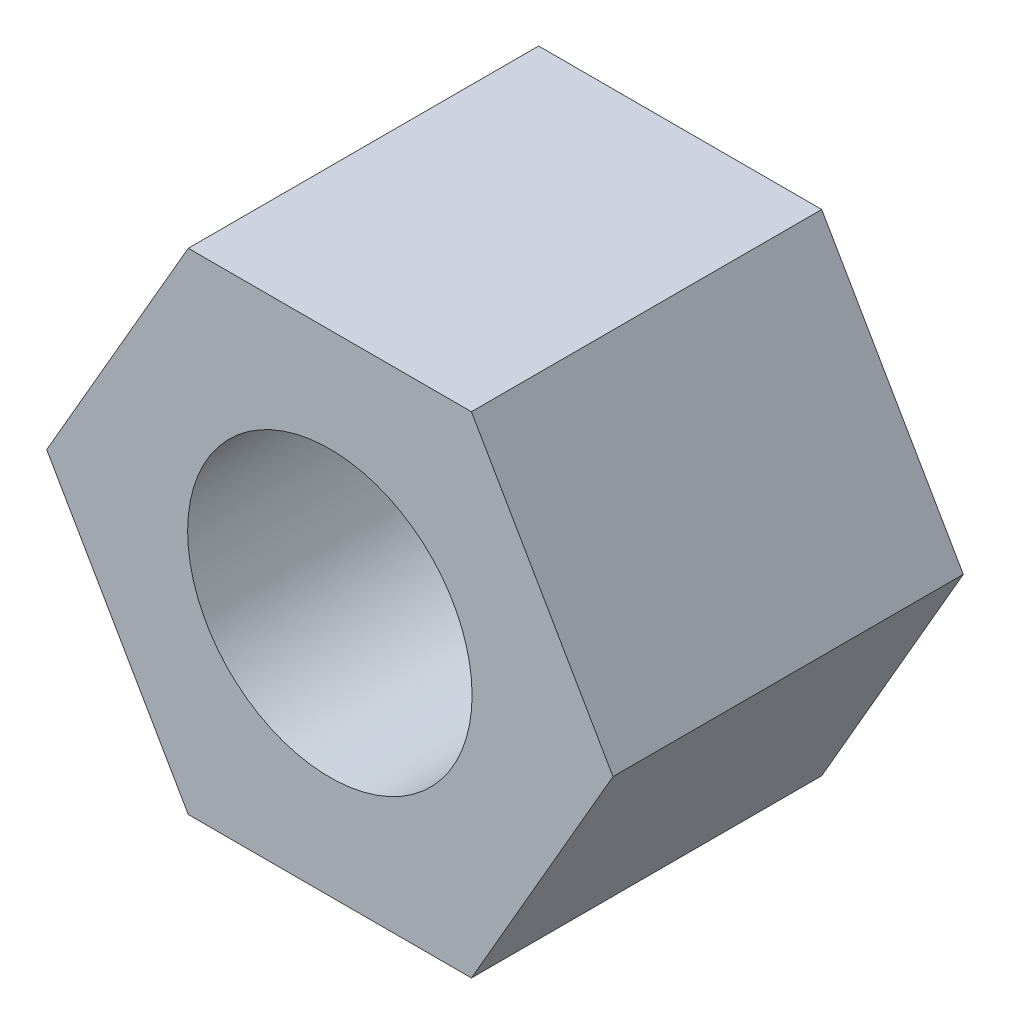
ISO-10303-21;
HEADER;
FILE_DESCRIPTION(('STEP AP214'),'2;1');
FILE_NAME('part.step','',(''),(''),'','','');
FILE_SCHEMA(('AUTOMOTIVE_DESIGN { 1 0 10303 214 1 1 1 1 }'));
ENDSEC;
DATA;
#1=APPLICATION_CONTEXT('core data for automotive mechanical design processes');
#2=APPLICATION_PROTOCOL_DEFINITION('international standard','automotive_design',2000,#1);
#3=PRODUCT_CONTEXT('',#1,'mechanical');
#4=PRODUCT('Part','Part','',(#3));
#5=PRODUCT_RELATED_PRODUCT_CATEGORY('part','',(#4));
#6=PRODUCT_DEFINITION_FORMATION('','',#4);
#7=PRODUCT_DEFINITION_CONTEXT('part definition',#1,'design');
#8=PRODUCT_DEFINITION('design','',#6,#7);
#9=PRODUCT_DEFINITION_SHAPE('','',#8);
#10=(LENGTH_UNIT() NAMED_UNIT(*) SI_UNIT(.MILLI.,.METRE.));
#11=(NAMED_UNIT(*) PLANE_ANGLE_UNIT() SI_UNIT($,.RADIAN.));
#12=(NAMED_UNIT(*) SI_UNIT($,.STERADIAN.) SOLID_ANGLE_UNIT());
#13=UNCERTAINTY_MEASURE_WITH_UNIT(LENGTH_MEASURE(1.E-05),#10,'distance_accuracy_value','');
#14=(GEOMETRIC_REPRESENTATION_CONTEXT(3) GLOBAL_UNCERTAINTY_ASSIGNED_CONTEXT((#13)) GLOBAL_UNIT_ASSIGNED_CONTEXT((#10,
#11,#12)) REPRESENTATION_CONTEXT('',''));
#15=CARTESIAN_POINT('',(0.,0.,0.));
#16=DIRECTION('',(0.,0.,1.));
#17=DIRECTION('',(1.,0.,0.));
#18=AXIS2_PLACEMENT_3D('',#15,#16,#17);
#19=CARTESIAN_POINT('',(0.,0.,5.));
#20=DIRECTION('',(0.,0.,1.));
#21=DIRECTION('',(1.,0.,0.));
#22=AXIS2_PLACEMENT_3D('',#19,#20,#21);
#23=PLANE('',#22);
#24=DIRECTION('',(0.5,0.866025403784439,0.));
#25=VECTOR('',#24,1.);
#26=CARTESIAN_POINT('',(2.02072594216369,-3.5,5.));
#27=LINE('',#26,#25);
#28=CARTESIAN_POINT('',(2.02072594216369,-3.5,5.));
#29=VERTEX_POINT('',#28);
#30=CARTESIAN_POINT('',(4.04145188432738,0.,5.));
#31=VERTEX_POINT('',#30);
#32=EDGE_CURVE('E133',#29,#31,#27,.T.);
#33=ORIENTED_EDGE('',*,*,#32,.T.);
#34=DIRECTION('',(-0.5,0.866025403784439,0.));
#35=VECTOR('',#34,1.);
#36=CARTESIAN_POINT('',(4.04145188432738,0.,5.));
#37=LINE('',#36,#35);
#38=CARTESIAN_POINT('',(2.02072594216369,3.5,5.));
#39=VERTEX_POINT('',#38);
#40=EDGE_CURVE('E91',#31,#39,#37,.T.);
#41=ORIENTED_EDGE('',*,*,#40,.T.);
#42=DIRECTION('',(-1.,0.,0.));
#43=VECTOR('',#42,1.);
#44=CARTESIAN_POINT('',(2.02072594216369,3.5,5.));
#45=LINE('',#44,#43);
#46=CARTESIAN_POINT('',(-2.02072594216369,3.5,5.));
#47=VERTEX_POINT('',#46);
#48=EDGE_CURVE('E106',#39,#47,#45,.T.);
#49=ORIENTED_EDGE('',*,*,#48,.T.);
#50=DIRECTION('',(-0.5,-0.866025403784439,0.));
#51=VECTOR('',#50,1.);
#52=CARTESIAN_POINT('',(-2.02072594216369,3.5,5.));
#53=LINE('',#52,#51);
#54=CARTESIAN_POINT('',(-4.04145188432738,0.,5.));
#55=VERTEX_POINT('',#54);
#56=EDGE_CURVE('E99',#47,#55,#53,.T.);
#57=ORIENTED_EDGE('',*,*,#56,.T.);
#58=DIRECTION('',(0.5,-0.866025403784439,0.));
#59=VECTOR('',#58,1.);
#60=CARTESIAN_POINT('',(-4.04145188432738,0.,5.));
#61=LINE('',#60,#59);
#62=CARTESIAN_POINT('',(-2.02072594216369,-3.5,5.));
#63=VERTEX_POINT('',#62);
#64=EDGE_CURVE('E102',#55,#63,#61,.T.);
#65=ORIENTED_EDGE('',*,*,#64,.T.);
#66=DIRECTION('',(1.,0.,0.));
#67=VECTOR('',#66,1.);
#68=CARTESIAN_POINT('',(-2.02072594216369,-3.5,5.));
#69=LINE('',#68,#67);
#70=EDGE_CURVE('E57',#63,#29,#69,.T.);
#71=ORIENTED_EDGE('',*,*,#70,.T.);
#72=EDGE_LOOP('',(#33,#41,#49,#57,#65,#71));
#73=FACE_BOUND('',#72,.T.);
#74=CARTESIAN_POINT('',(0.,0.,5.));
#75=DIRECTION('',(0.,0.,1.));
#76=DIRECTION('',(1.,0.,0.));
#77=AXIS2_PLACEMENT_3D('',#74,#75,#76);
#78=CIRCLE('',#77,2.03);
#79=CARTESIAN_POINT('',(2.03,0.,5.));
#80=VERTEX_POINT('',#79);
#81=EDGE_CURVE('E126',#80,#80,#78,.T.);
#82=ORIENTED_EDGE('',*,*,#81,.F.);
#83=EDGE_LOOP('',(#82));
#84=FACE_BOUND('',#83,.T.);
#85=ADVANCED_FACE('F39',(#73,#84),#23,.T.);
#86=CARTESIAN_POINT('',(0.,0.,0.));
#87=DIRECTION('',(0.,0.,1.));
#88=DIRECTION('',(1.,0.,0.));
#89=AXIS2_PLACEMENT_3D('',#86,#87,#88);
#90=PLANE('',#89);
#91=DIRECTION('',(0.5,0.866025403784439,0.));
#92=VECTOR('',#91,1.);
#93=CARTESIAN_POINT('',(2.02072594216369,-3.5,0.));
#94=LINE('',#93,#92);
#95=CARTESIAN_POINT('',(2.02072594216369,-3.5,0.));
#96=VERTEX_POINT('',#95);
#97=CARTESIAN_POINT('',(4.04145188432738,0.,0.));
#98=VERTEX_POINT('',#97);
#99=EDGE_CURVE('E123',#96,#98,#94,.T.);
#100=ORIENTED_EDGE('',*,*,#99,.F.);
#101=DIRECTION('',(1.,0.,0.));
#102=VECTOR('',#101,1.);
#103=CARTESIAN_POINT('',(-2.02072594216369,-3.5,0.));
#104=LINE('',#103,#102);
#105=CARTESIAN_POINT('',(-2.02072594216369,-3.5,0.));
#106=VERTEX_POINT('',#105);
#107=EDGE_CURVE('E84',#106,#96,#104,.T.);
#108=ORIENTED_EDGE('',*,*,#107,.F.);
#109=DIRECTION('',(0.5,-0.866025403784439,0.));
#110=VECTOR('',#109,1.);
#111=CARTESIAN_POINT('',(-4.04145188432738,0.,0.));
#112=LINE('',#111,#110);
#113=CARTESIAN_POINT('',(-4.04145188432738,0.,0.));
#114=VERTEX_POINT('',#113);
#115=EDGE_CURVE('E76',#114,#106,#112,.T.);
#116=ORIENTED_EDGE('',*,*,#115,.F.);
#117=DIRECTION('',(-0.5,-0.866025403784439,0.));
#118=VECTOR('',#117,1.);
#119=CARTESIAN_POINT('',(-2.02072594216369,3.5,0.));
#120=LINE('',#119,#118);
#121=CARTESIAN_POINT('',(-2.02072594216369,3.5,0.));
#122=VERTEX_POINT('',#121);
#123=EDGE_CURVE('E111',#122,#114,#120,.T.);
#124=ORIENTED_EDGE('',*,*,#123,.F.);
#125=DIRECTION('',(-1.,0.,0.));
#126=VECTOR('',#125,1.);
#127=CARTESIAN_POINT('',(2.02072594216369,3.5,0.));
#128=LINE('',#127,#126);
#129=CARTESIAN_POINT('',(2.02072594216369,3.5,0.));
#130=VERTEX_POINT('',#129);
#131=EDGE_CURVE('E128',#130,#122,#128,.T.);
#132=ORIENTED_EDGE('',*,*,#131,.F.);
#133=DIRECTION('',(-0.5,0.866025403784439,0.));
#134=VECTOR('',#133,1.);
#135=CARTESIAN_POINT('',(4.04145188432738,0.,0.));
#136=LINE('',#135,#134);
#137=EDGE_CURVE('E130',#98,#130,#136,.T.);
#138=ORIENTED_EDGE('',*,*,#137,.F.);
#139=EDGE_LOOP('',(#100,#108,#116,#124,#132,#138));
#140=FACE_BOUND('',#139,.T.);
#141=CARTESIAN_POINT('',(0.,0.,0.));
#142=DIRECTION('',(0.,0.,1.));
#143=DIRECTION('',(1.,0.,0.));
#144=AXIS2_PLACEMENT_3D('',#141,#142,#143);
#145=CIRCLE('',#144,2.03);
#146=CARTESIAN_POINT('',(2.03,0.,0.));
#147=VERTEX_POINT('',#146);
#148=EDGE_CURVE('E229',#147,#147,#145,.T.);
#149=ORIENTED_EDGE('',*,*,#148,.T.);
#150=EDGE_LOOP('',(#149));
#151=FACE_BOUND('',#150,.T.);
#152=ADVANCED_FACE('F145',(#140,#151),#90,.F.);
#153=CARTESIAN_POINT('',(2.02072594216369,-3.5,5.));
#154=DIRECTION('',(-0.866025403784439,0.5,0.));
#155=DIRECTION('',(-0.5,-0.866025403784439,0.));
#156=AXIS2_PLACEMENT_3D('',#153,#154,#155);
#157=PLANE('',#156);
#158=ORIENTED_EDGE('',*,*,#99,.T.);
#159=DIRECTION('',(0.,0.,-1.));
#160=VECTOR('',#159,1.);
#161=CARTESIAN_POINT('',(4.04145188432738,0.,5.));
#162=LINE('',#161,#160);
#163=EDGE_CURVE('E11',#31,#98,#162,.T.);
#164=ORIENTED_EDGE('',*,*,#163,.F.);
#165=ORIENTED_EDGE('',*,*,#32,.F.);
#166=DIRECTION('',(0.,0.,-1.));
#167=VECTOR('',#166,1.);
#168=CARTESIAN_POINT('',(2.02072594216369,-3.5,5.));
#169=LINE('',#168,#167);
#170=EDGE_CURVE('E118',#29,#96,#169,.T.);
#171=ORIENTED_EDGE('',*,*,#170,.T.);
#172=EDGE_LOOP('',(#158,#164,#165,#171));
#173=FACE_BOUND('',#172,.T.);
#174=ADVANCED_FACE('F41',(#173),#157,.F.);
#175=CARTESIAN_POINT('',(4.04145188432738,0.,5.));
#176=DIRECTION('',(-0.866025403784439,-0.5,0.));
#177=DIRECTION('',(0.5,-0.866025403784439,0.));
#178=AXIS2_PLACEMENT_3D('',#175,#176,#177);
#179=PLANE('',#178);
#180=ORIENTED_EDGE('',*,*,#137,.T.);
#181=DIRECTION('',(0.,0.,-1.));
#182=VECTOR('',#181,1.);
#183=CARTESIAN_POINT('',(2.02072594216369,3.5,5.));
#184=LINE('',#183,#182);
#185=EDGE_CURVE('E48',#39,#130,#184,.T.);
#186=ORIENTED_EDGE('',*,*,#185,.F.);
#187=ORIENTED_EDGE('',*,*,#40,.F.);
#188=ORIENTED_EDGE('',*,*,#163,.T.);
#189=EDGE_LOOP('',(#180,#186,#187,#188));
#190=FACE_BOUND('',#189,.T.);
#191=ADVANCED_FACE('F166',(#190),#179,.F.);
#192=CARTESIAN_POINT('',(2.02072594216369,3.5,5.));
#193=DIRECTION('',(0.,-1.,0.));
#194=DIRECTION('',(1.,0.,0.));
#195=AXIS2_PLACEMENT_3D('',#192,#193,#194);
#196=PLANE('',#195);
#197=ORIENTED_EDGE('',*,*,#131,.T.);
#198=DIRECTION('',(0.,0.,-1.));
#199=VECTOR('',#198,1.);
#200=CARTESIAN_POINT('',(-2.02072594216369,3.5,5.));
#201=LINE('',#200,#199);
#202=EDGE_CURVE('E113',#47,#122,#201,.T.);
#203=ORIENTED_EDGE('',*,*,#202,.F.);
#204=ORIENTED_EDGE('',*,*,#48,.F.);
#205=ORIENTED_EDGE('',*,*,#185,.T.);
#206=EDGE_LOOP('',(#197,#203,#204,#205));
#207=FACE_BOUND('',#206,.T.);
#208=ADVANCED_FACE('F143',(#207),#196,.F.);
#209=CARTESIAN_POINT('',(-2.02072594216369,3.5,5.));
#210=DIRECTION('',(0.866025403784438,-0.5,0.));
#211=DIRECTION('',(0.5,0.866025403784439,0.));
#212=AXIS2_PLACEMENT_3D('',#209,#210,#211);
#213=PLANE('',#212);
#214=ORIENTED_EDGE('',*,*,#123,.T.);
#215=DIRECTION('',(0.,0.,-1.));
#216=VECTOR('',#215,1.);
#217=CARTESIAN_POINT('',(-4.04145188432738,0.,5.));
#218=LINE('',#217,#216);
#219=EDGE_CURVE('E112',#55,#114,#218,.T.);
#220=ORIENTED_EDGE('',*,*,#219,.F.);
#221=ORIENTED_EDGE('',*,*,#56,.F.);
#222=ORIENTED_EDGE('',*,*,#202,.T.);
#223=EDGE_LOOP('',(#214,#220,#221,#222));
#224=FACE_BOUND('',#223,.T.);
#225=ADVANCED_FACE('F115',(#224),#213,.F.);
#226=CARTESIAN_POINT('',(-4.04145188432738,0.,5.));
#227=DIRECTION('',(0.866025403784439,0.5,0.));
#228=DIRECTION('',(-0.5,0.866025403784439,0.));
#229=AXIS2_PLACEMENT_3D('',#226,#227,#228);
#230=PLANE('',#229);
#231=ORIENTED_EDGE('',*,*,#115,.T.);
#232=DIRECTION('',(0.,0.,-1.));
#233=VECTOR('',#232,1.);
#234=CARTESIAN_POINT('',(-2.02072594216369,-3.5,5.));
#235=LINE('',#234,#233);
#236=EDGE_CURVE('E117',#63,#106,#235,.T.);
#237=ORIENTED_EDGE('',*,*,#236,.F.);
#238=ORIENTED_EDGE('',*,*,#64,.F.);
#239=ORIENTED_EDGE('',*,*,#219,.T.);
#240=EDGE_LOOP('',(#231,#237,#238,#239));
#241=FACE_BOUND('',#240,.T.);
#242=ADVANCED_FACE('F119',(#241),#230,.F.);
#243=CARTESIAN_POINT('',(-2.02072594216369,-3.5,5.));
#244=DIRECTION('',(0.,1.,0.));
#245=DIRECTION('',(-1.,0.,0.));
#246=AXIS2_PLACEMENT_3D('',#243,#244,#245);
#247=PLANE('',#246);
#248=ORIENTED_EDGE('',*,*,#107,.T.);
#249=ORIENTED_EDGE('',*,*,#170,.F.);
#250=ORIENTED_EDGE('',*,*,#70,.F.);
#251=ORIENTED_EDGE('',*,*,#236,.T.);
#252=EDGE_LOOP('',(#248,#249,#250,#251));
#253=FACE_BOUND('',#252,.T.);
#254=ADVANCED_FACE('F149',(#253),#247,.F.);
#255=CARTESIAN_POINT('',(0.,0.,5.));
#256=DIRECTION('',(0.,0.,-1.));
#257=DIRECTION('',(-1.,0.,0.));
#258=AXIS2_PLACEMENT_3D('',#255,#256,#257);
#259=CYLINDRICAL_SURFACE('',#258,2.03);
#260=ORIENTED_EDGE('',*,*,#81,.T.);
#261=EDGE_LOOP('',(#260));
#262=FACE_BOUND('',#261,.T.);
#263=ORIENTED_EDGE('',*,*,#148,.F.);
#264=EDGE_LOOP('',(#263));
#265=FACE_BOUND('',#264,.T.);
#266=ADVANCED_FACE('F151',(#262,#265),#259,.F.);
#267=CLOSED_SHELL('',(#85,#152,#174,#191,#208,#225,#242,#254,#266));
#268=MANIFOLD_SOLID_BREP('B2',#267);
#269=ADVANCED_BREP_SHAPE_REPRESENTATION('',(#18,#268),#14);
#270=SHAPE_DEFINITION_REPRESENTATION(#9,#269);
ENDSEC;
END-ISO-10303-21;
